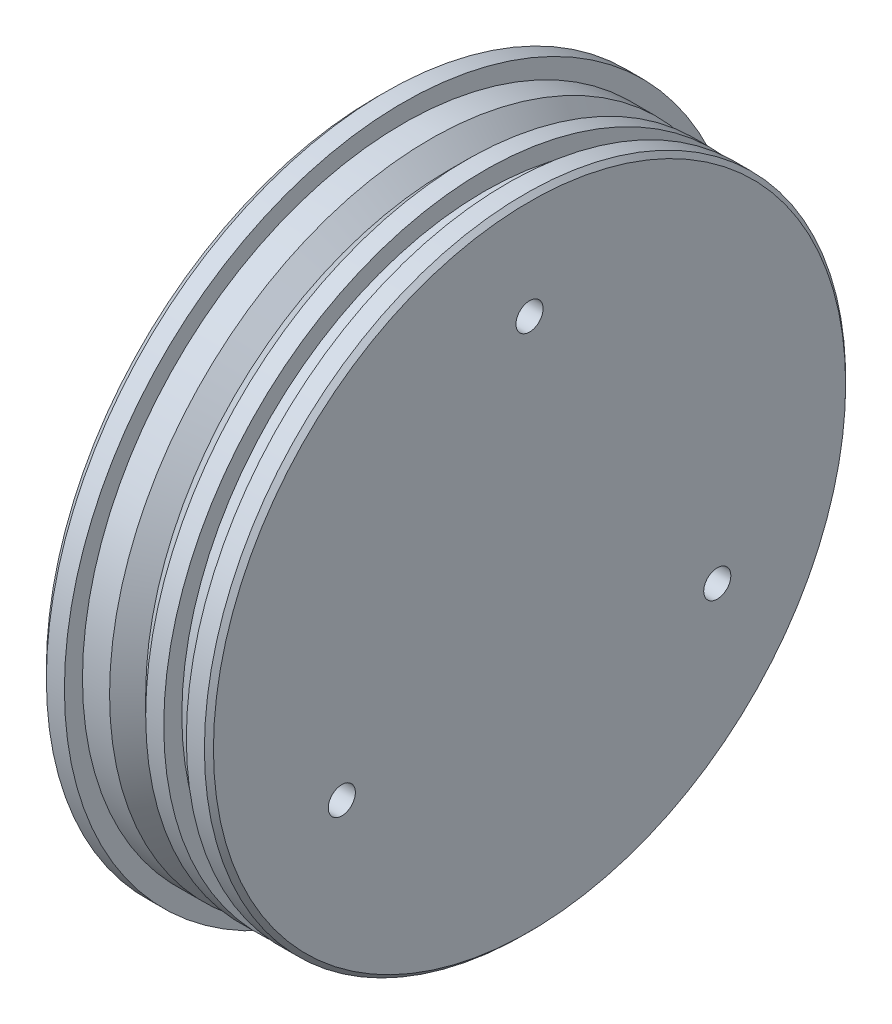
ISO-10303-21;
HEADER;
FILE_DESCRIPTION(('STEP AP214'),'2;1');
FILE_NAME('part.step','',(''),(''),'','','');
FILE_SCHEMA(('AUTOMOTIVE_DESIGN { 1 0 10303 214 1 1 1 1 }'));
ENDSEC;
DATA;
#1=APPLICATION_CONTEXT('core data for automotive mechanical design processes');
#2=APPLICATION_PROTOCOL_DEFINITION('international standard','automotive_design',2000,#1);
#3=PRODUCT_CONTEXT('',#1,'mechanical');
#4=PRODUCT('Part','Part','',(#3));
#5=PRODUCT_RELATED_PRODUCT_CATEGORY('part','',(#4));
#6=PRODUCT_DEFINITION_FORMATION('','',#4);
#7=PRODUCT_DEFINITION_CONTEXT('part definition',#1,'design');
#8=PRODUCT_DEFINITION('design','',#6,#7);
#9=PRODUCT_DEFINITION_SHAPE('','',#8);
#10=(LENGTH_UNIT() NAMED_UNIT(*) SI_UNIT(.MILLI.,.METRE.));
#11=(NAMED_UNIT(*) PLANE_ANGLE_UNIT() SI_UNIT($,.RADIAN.));
#12=(NAMED_UNIT(*) SI_UNIT($,.STERADIAN.) SOLID_ANGLE_UNIT());
#13=UNCERTAINTY_MEASURE_WITH_UNIT(LENGTH_MEASURE(1.E-05),#10,'distance_accuracy_value','');
#14=(GEOMETRIC_REPRESENTATION_CONTEXT(3) GLOBAL_UNCERTAINTY_ASSIGNED_CONTEXT((#13)) GLOBAL_UNIT_ASSIGNED_CONTEXT((#10,
#11,#12)) REPRESENTATION_CONTEXT('',''));
#15=CARTESIAN_POINT('',(0.,0.,0.));
#16=DIRECTION('',(0.,0.,1.));
#17=DIRECTION('',(1.,0.,0.));
#18=AXIS2_PLACEMENT_3D('',#15,#16,#17);
#19=CARTESIAN_POINT('',(-17.,0.,0.));
#20=DIRECTION('',(1.,0.,0.));
#21=DIRECTION('',(0.,0.,-1.));
#22=AXIS2_PLACEMENT_3D('',#19,#20,#21);
#23=PLANE('',#22);
#24=CARTESIAN_POINT('',(-17.,0.,0.));
#25=DIRECTION('',(-1.,0.,0.));
#26=DIRECTION('',(0.,0.,1.));
#27=AXIS2_PLACEMENT_3D('',#24,#25,#26);
#28=CIRCLE('',#27,36.5);
#29=CARTESIAN_POINT('',(-17.,0.,36.5));
#30=VERTEX_POINT('',#29);
#31=EDGE_CURVE('E10',#30,#30,#28,.T.);
#32=ORIENTED_EDGE('',*,*,#31,.T.);
#33=EDGE_LOOP('',(#32));
#34=FACE_BOUND('',#33,.T.);
#35=ADVANCED_FACE('F37',(#34),#23,.F.);
#36=CARTESIAN_POINT('',(-16.,0.,0.));
#37=DIRECTION('',(1.,0.,0.));
#38=DIRECTION('',(0.,0.,-1.));
#39=AXIS2_PLACEMENT_3D('',#36,#37,#38);
#40=CONICAL_SURFACE('',#39,37.5,0.78539816339745);
#41=ORIENTED_EDGE('',*,*,#31,.F.);
#42=EDGE_LOOP('',(#41));
#43=FACE_BOUND('',#42,.T.);
#44=CARTESIAN_POINT('',(-16.,0.,0.));
#45=DIRECTION('',(-1.,0.,0.));
#46=DIRECTION('',(0.,0.,1.));
#47=AXIS2_PLACEMENT_3D('',#44,#45,#46);
#48=CIRCLE('',#47,37.5);
#49=CARTESIAN_POINT('',(-16.,0.,37.5));
#50=VERTEX_POINT('',#49);
#51=EDGE_CURVE('E43',#50,#50,#48,.T.);
#52=ORIENTED_EDGE('',*,*,#51,.T.);
#53=EDGE_LOOP('',(#52));
#54=FACE_BOUND('',#53,.T.);
#55=ADVANCED_FACE('F135',(#43,#54),#40,.T.);
#56=CARTESIAN_POINT('',(0.,0.,0.));
#57=DIRECTION('',(-1.,0.,0.));
#58=DIRECTION('',(0.,0.,1.));
#59=AXIS2_PLACEMENT_3D('',#56,#57,#58);
#60=CYLINDRICAL_SURFACE('',#59,37.5);
#61=ORIENTED_EDGE('',*,*,#51,.F.);
#62=EDGE_LOOP('',(#61));
#63=FACE_BOUND('',#62,.T.);
#64=CARTESIAN_POINT('',(-14.,0.,0.));
#65=DIRECTION('',(-1.,0.,0.));
#66=DIRECTION('',(0.,0.,1.));
#67=AXIS2_PLACEMENT_3D('',#64,#65,#66);
#68=CIRCLE('',#67,37.5);
#69=CARTESIAN_POINT('',(-14.,0.,37.5));
#70=VERTEX_POINT('',#69);
#71=EDGE_CURVE('E47',#70,#70,#68,.T.);
#72=ORIENTED_EDGE('',*,*,#71,.T.);
#73=EDGE_LOOP('',(#72));
#74=FACE_BOUND('',#73,.T.);
#75=ADVANCED_FACE('F139',(#63,#74),#60,.T.);
#76=CARTESIAN_POINT('',(-14.,37.5,0.));
#77=DIRECTION('',(-1.,0.,0.));
#78=DIRECTION('',(0.,0.,1.));
#79=AXIS2_PLACEMENT_3D('',#76,#77,#78);
#80=PLANE('',#79);
#81=ORIENTED_EDGE('',*,*,#71,.F.);
#82=EDGE_LOOP('',(#81));
#83=FACE_BOUND('',#82,.T.);
#84=CARTESIAN_POINT('',(-14.,0.,0.));
#85=DIRECTION('',(-1.,0.,0.));
#86=DIRECTION('',(0.,0.,1.));
#87=AXIS2_PLACEMENT_3D('',#84,#85,#86);
#88=CIRCLE('',#87,35.5);
#89=CARTESIAN_POINT('',(-14.,0.,35.5));
#90=VERTEX_POINT('',#89);
#91=EDGE_CURVE('E51',#90,#90,#88,.T.);
#92=ORIENTED_EDGE('',*,*,#91,.T.);
#93=EDGE_LOOP('',(#92));
#94=FACE_BOUND('',#93,.T.);
#95=ADVANCED_FACE('F144',(#83,#94),#80,.F.);
#96=CARTESIAN_POINT('',(0.,0.,0.));
#97=DIRECTION('',(-1.,0.,0.));
#98=DIRECTION('',(0.,0.,1.));
#99=AXIS2_PLACEMENT_3D('',#96,#97,#98);
#100=CYLINDRICAL_SURFACE('',#99,35.5);
#101=ORIENTED_EDGE('',*,*,#91,.F.);
#102=EDGE_LOOP('',(#101));
#103=FACE_BOUND('',#102,.T.);
#104=CARTESIAN_POINT('',(-11.,0.,0.));
#105=DIRECTION('',(-1.,0.,0.));
#106=DIRECTION('',(0.,0.,1.));
#107=AXIS2_PLACEMENT_3D('',#104,#105,#106);
#108=CIRCLE('',#107,35.5);
#109=CARTESIAN_POINT('',(-11.,0.,35.5));
#110=VERTEX_POINT('',#109);
#111=EDGE_CURVE('E56',#110,#110,#108,.T.);
#112=ORIENTED_EDGE('',*,*,#111,.T.);
#113=EDGE_LOOP('',(#112));
#114=FACE_BOUND('',#113,.T.);
#115=ADVANCED_FACE('F150',(#103,#114),#100,.T.);
#116=CARTESIAN_POINT('',(-9.00000000000003,0.,0.));
#117=DIRECTION('',(-1.,0.,0.));
#118=DIRECTION('',(0.,0.,1.));
#119=AXIS2_PLACEMENT_3D('',#116,#117,#118);
#120=CONICAL_SURFACE('',#119,33.5,0.78539816339745);
#121=ORIENTED_EDGE('',*,*,#111,.F.);
#122=EDGE_LOOP('',(#121));
#123=FACE_BOUND('',#122,.T.);
#124=CARTESIAN_POINT('',(-9.00000000000003,0.,0.));
#125=DIRECTION('',(-1.,0.,0.));
#126=DIRECTION('',(0.,0.,1.));
#127=AXIS2_PLACEMENT_3D('',#124,#125,#126);
#128=CIRCLE('',#127,33.5);
#129=CARTESIAN_POINT('',(-9.00000000000003,0.,33.5));
#130=VERTEX_POINT('',#129);
#131=EDGE_CURVE('E59',#130,#130,#128,.T.);
#132=ORIENTED_EDGE('',*,*,#131,.T.);
#133=EDGE_LOOP('',(#132));
#134=FACE_BOUND('',#133,.T.);
#135=ADVANCED_FACE('F154',(#123,#134),#120,.T.);
#136=CARTESIAN_POINT('',(-7.00000000000002,0.,0.));
#137=DIRECTION('',(1.,0.,0.));
#138=DIRECTION('',(0.,0.,-1.));
#139=AXIS2_PLACEMENT_3D('',#136,#137,#138);
#140=CONICAL_SURFACE('',#139,35.5,0.785398163397443);
#141=ORIENTED_EDGE('',*,*,#131,.F.);
#142=EDGE_LOOP('',(#141));
#143=FACE_BOUND('',#142,.T.);
#144=CARTESIAN_POINT('',(-7.00000000000002,0.,0.));
#145=DIRECTION('',(-1.,0.,0.));
#146=DIRECTION('',(0.,0.,1.));
#147=AXIS2_PLACEMENT_3D('',#144,#145,#146);
#148=CIRCLE('',#147,35.5);
#149=CARTESIAN_POINT('',(-7.00000000000002,0.,35.5));
#150=VERTEX_POINT('',#149);
#151=EDGE_CURVE('E62',#150,#150,#148,.T.);
#152=ORIENTED_EDGE('',*,*,#151,.T.);
#153=EDGE_LOOP('',(#152));
#154=FACE_BOUND('',#153,.T.);
#155=ADVANCED_FACE('F158',(#143,#154),#140,.T.);
#156=CARTESIAN_POINT('',(0.,0.,0.));
#157=DIRECTION('',(-1.,0.,0.));
#158=DIRECTION('',(0.,0.,1.));
#159=AXIS2_PLACEMENT_3D('',#156,#157,#158);
#160=CYLINDRICAL_SURFACE('',#159,35.5);
#161=ORIENTED_EDGE('',*,*,#151,.F.);
#162=EDGE_LOOP('',(#161));
#163=FACE_BOUND('',#162,.T.);
#164=CARTESIAN_POINT('',(-5.00000000000002,0.,0.));
#165=DIRECTION('',(-1.,0.,0.));
#166=DIRECTION('',(0.,0.,1.));
#167=AXIS2_PLACEMENT_3D('',#164,#165,#166);
#168=CIRCLE('',#167,35.5);
#169=CARTESIAN_POINT('',(-5.00000000000002,0.,35.5));
#170=VERTEX_POINT('',#169);
#171=EDGE_CURVE('E65',#170,#170,#168,.T.);
#172=ORIENTED_EDGE('',*,*,#171,.T.);
#173=EDGE_LOOP('',(#172));
#174=FACE_BOUND('',#173,.T.);
#175=ADVANCED_FACE('F162',(#163,#174),#160,.T.);
#176=CARTESIAN_POINT('',(-5.00000000000002,35.5,0.));
#177=DIRECTION('',(-1.,0.,0.));
#178=DIRECTION('',(0.,0.,1.));
#179=AXIS2_PLACEMENT_3D('',#176,#177,#178);
#180=PLANE('',#179);
#181=ORIENTED_EDGE('',*,*,#171,.F.);
#182=EDGE_LOOP('',(#181));
#183=FACE_BOUND('',#182,.T.);
#184=CARTESIAN_POINT('',(-5.00000000000002,0.,0.));
#185=DIRECTION('',(-1.,0.,0.));
#186=DIRECTION('',(0.,0.,1.));
#187=AXIS2_PLACEMENT_3D('',#184,#185,#186);
#188=CIRCLE('',#187,33.5);
#189=CARTESIAN_POINT('',(-5.00000000000002,0.,33.5));
#190=VERTEX_POINT('',#189);
#191=EDGE_CURVE('E68',#190,#190,#188,.T.);
#192=ORIENTED_EDGE('',*,*,#191,.T.);
#193=EDGE_LOOP('',(#192));
#194=FACE_BOUND('',#193,.T.);
#195=ADVANCED_FACE('F166',(#183,#194),#180,.F.);
#196=CARTESIAN_POINT('',(0.,0.,0.));
#197=DIRECTION('',(-1.,0.,0.));
#198=DIRECTION('',(0.,0.,1.));
#199=AXIS2_PLACEMENT_3D('',#196,#197,#198);
#200=CYLINDRICAL_SURFACE('',#199,33.5);
#201=ORIENTED_EDGE('',*,*,#191,.F.);
#202=EDGE_LOOP('',(#201));
#203=FACE_BOUND('',#202,.T.);
#204=CARTESIAN_POINT('',(-2.50000000000002,0.,0.));
#205=DIRECTION('',(-1.,0.,0.));
#206=DIRECTION('',(0.,0.,1.));
#207=AXIS2_PLACEMENT_3D('',#204,#205,#206);
#208=CIRCLE('',#207,33.5);
#209=CARTESIAN_POINT('',(-2.50000000000002,0.,33.5));
#210=VERTEX_POINT('',#209);
#211=EDGE_CURVE('E71',#210,#210,#208,.T.);
#212=ORIENTED_EDGE('',*,*,#211,.T.);
#213=EDGE_LOOP('',(#212));
#214=FACE_BOUND('',#213,.T.);
#215=ADVANCED_FACE('F170',(#203,#214),#200,.T.);
#216=CARTESIAN_POINT('',(-2.50000000000001,33.5,0.));
#217=DIRECTION('',(1.,0.,0.));
#218=DIRECTION('',(0.,0.,-1.));
#219=AXIS2_PLACEMENT_3D('',#216,#217,#218);
#220=PLANE('',#219);
#221=ORIENTED_EDGE('',*,*,#211,.F.);
#222=EDGE_LOOP('',(#221));
#223=FACE_BOUND('',#222,.T.);
#224=CARTESIAN_POINT('',(-2.50000000000001,0.,0.));
#225=DIRECTION('',(-1.,0.,0.));
#226=DIRECTION('',(0.,0.,1.));
#227=AXIS2_PLACEMENT_3D('',#224,#225,#226);
#228=CIRCLE('',#227,35.5);
#229=CARTESIAN_POINT('',(-2.50000000000001,0.,35.5));
#230=VERTEX_POINT('',#229);
#231=EDGE_CURVE('E74',#230,#230,#228,.T.);
#232=ORIENTED_EDGE('',*,*,#231,.T.);
#233=EDGE_LOOP('',(#232));
#234=FACE_BOUND('',#233,.T.);
#235=ADVANCED_FACE('F130',(#223,#234),#220,.F.);
#236=CARTESIAN_POINT('',(0.,0.,0.));
#237=DIRECTION('',(-1.,0.,0.));
#238=DIRECTION('',(0.,0.,1.));
#239=AXIS2_PLACEMENT_3D('',#236,#237,#238);
#240=CYLINDRICAL_SURFACE('',#239,35.5);
#241=ORIENTED_EDGE('',*,*,#231,.F.);
#242=EDGE_LOOP('',(#241));
#243=FACE_BOUND('',#242,.T.);
#244=CARTESIAN_POINT('',(-0.500000000000004,0.,0.));
#245=DIRECTION('',(-1.,0.,0.));
#246=DIRECTION('',(0.,0.,1.));
#247=AXIS2_PLACEMENT_3D('',#244,#245,#246);
#248=CIRCLE('',#247,35.5);
#249=CARTESIAN_POINT('',(-0.500000000000004,0.,35.5));
#250=VERTEX_POINT('',#249);
#251=EDGE_CURVE('E77',#250,#250,#248,.T.);
#252=ORIENTED_EDGE('',*,*,#251,.T.);
#253=EDGE_LOOP('',(#252));
#254=FACE_BOUND('',#253,.T.);
#255=ADVANCED_FACE('F124',(#243,#254),#240,.T.);
#256=CARTESIAN_POINT('',(0.,0.,0.));
#257=DIRECTION('',(-1.,0.,0.));
#258=DIRECTION('',(0.,0.,1.));
#259=AXIS2_PLACEMENT_3D('',#256,#257,#258);
#260=CONICAL_SURFACE('',#259,35.,0.785398163397446);
#261=ORIENTED_EDGE('',*,*,#251,.F.);
#262=EDGE_LOOP('',(#261));
#263=FACE_BOUND('',#262,.T.);
#264=CARTESIAN_POINT('',(0.,0.,0.));
#265=DIRECTION('',(-1.,0.,0.));
#266=DIRECTION('',(0.,0.,1.));
#267=AXIS2_PLACEMENT_3D('',#264,#265,#266);
#268=CIRCLE('',#267,35.);
#269=CARTESIAN_POINT('',(0.,0.,35.));
#270=VERTEX_POINT('',#269);
#271=EDGE_CURVE('E80',#270,#270,#268,.T.);
#272=ORIENTED_EDGE('',*,*,#271,.T.);
#273=EDGE_LOOP('',(#272));
#274=FACE_BOUND('',#273,.T.);
#275=ADVANCED_FACE('F115',(#263,#274),#260,.T.);
#276=CARTESIAN_POINT('',(0.,35.,0.));
#277=DIRECTION('',(-1.,0.,0.));
#278=DIRECTION('',(0.,0.,1.));
#279=AXIS2_PLACEMENT_3D('',#276,#277,#278);
#280=PLANE('',#279);
#281=CARTESIAN_POINT('',(0.,24.,0.));
#282=DIRECTION('',(1.,0.,0.));
#283=DIRECTION('',(0.,0.,-1.));
#284=AXIS2_PLACEMENT_3D('',#281,#282,#283);
#285=CIRCLE('',#284,1.5);
#286=CARTESIAN_POINT('',(0.,24.,-1.5));
#287=VERTEX_POINT('',#286);
#288=EDGE_CURVE('E96',#287,#287,#285,.T.);
#289=ORIENTED_EDGE('',*,*,#288,.F.);
#290=EDGE_LOOP('',(#289));
#291=FACE_BOUND('',#290,.T.);
#292=CARTESIAN_POINT('',(0.,-12.,-20.7846096908265));
#293=DIRECTION('',(1.,0.,0.));
#294=DIRECTION('',(0.,0.,-1.));
#295=AXIS2_PLACEMENT_3D('',#292,#293,#294);
#296=CIRCLE('',#295,1.5);
#297=CARTESIAN_POINT('',(0.,-12.,-22.2846096908265));
#298=VERTEX_POINT('',#297);
#299=EDGE_CURVE('E90',#298,#298,#296,.T.);
#300=ORIENTED_EDGE('',*,*,#299,.F.);
#301=EDGE_LOOP('',(#300));
#302=FACE_BOUND('',#301,.T.);
#303=CARTESIAN_POINT('',(0.,-12.,20.7846096908265));
#304=DIRECTION('',(1.,0.,0.));
#305=DIRECTION('',(0.,0.,-1.));
#306=AXIS2_PLACEMENT_3D('',#303,#304,#305);
#307=CIRCLE('',#306,1.5);
#308=CARTESIAN_POINT('',(0.,-12.,19.2846096908265));
#309=VERTEX_POINT('',#308);
#310=EDGE_CURVE('E84',#309,#309,#307,.T.);
#311=ORIENTED_EDGE('',*,*,#310,.F.);
#312=EDGE_LOOP('',(#311));
#313=FACE_BOUND('',#312,.T.);
#314=ORIENTED_EDGE('',*,*,#271,.F.);
#315=EDGE_LOOP('',(#314));
#316=FACE_BOUND('',#315,.T.);
#317=ADVANCED_FACE('F111',(#291,#302,#313,#316),#280,.F.);
#318=CARTESIAN_POINT('',(-10.,-12.,20.7846096908265));
#319=DIRECTION('',(1.,0.,0.));
#320=DIRECTION('',(0.,0.,-1.));
#321=AXIS2_PLACEMENT_3D('',#318,#319,#320);
#322=CYLINDRICAL_SURFACE('',#321,1.5);
#323=CARTESIAN_POINT('',(-10.,-12.,20.7846096908265));
#324=DIRECTION('',(1.,0.,0.));
#325=DIRECTION('',(0.,0.,-1.));
#326=AXIS2_PLACEMENT_3D('',#323,#324,#325);
#327=CIRCLE('',#326,1.5);
#328=CARTESIAN_POINT('',(-10.,-12.,19.2846096908265));
#329=VERTEX_POINT('',#328);
#330=EDGE_CURVE('E87',#329,#329,#327,.T.);
#331=ORIENTED_EDGE('',*,*,#330,.F.);
#332=EDGE_LOOP('',(#331));
#333=FACE_BOUND('',#332,.T.);
#334=ORIENTED_EDGE('',*,*,#310,.T.);
#335=EDGE_LOOP('',(#334));
#336=FACE_BOUND('',#335,.T.);
#337=ADVANCED_FACE('F114',(#333,#336),#322,.F.);
#338=CARTESIAN_POINT('',(-10.,-12.,20.7846096908265));
#339=DIRECTION('',(1.,0.,0.));
#340=DIRECTION('',(0.,0.,-1.));
#341=AXIS2_PLACEMENT_3D('',#338,#339,#340);
#342=PLANE('',#341);
#343=ORIENTED_EDGE('',*,*,#330,.T.);
#344=EDGE_LOOP('',(#343));
#345=FACE_BOUND('',#344,.T.);
#346=ADVANCED_FACE('F209',(#345),#342,.T.);
#347=CARTESIAN_POINT('',(-10.,-12.,-20.7846096908265));
#348=DIRECTION('',(1.,0.,0.));
#349=DIRECTION('',(0.,0.,-1.));
#350=AXIS2_PLACEMENT_3D('',#347,#348,#349);
#351=CYLINDRICAL_SURFACE('',#350,1.5);
#352=CARTESIAN_POINT('',(-10.,-12.,-20.7846096908265));
#353=DIRECTION('',(1.,0.,0.));
#354=DIRECTION('',(0.,0.,-1.));
#355=AXIS2_PLACEMENT_3D('',#352,#353,#354);
#356=CIRCLE('',#355,1.5);
#357=CARTESIAN_POINT('',(-10.,-12.,-22.2846096908265));
#358=VERTEX_POINT('',#357);
#359=EDGE_CURVE('E93',#358,#358,#356,.T.);
#360=ORIENTED_EDGE('',*,*,#359,.F.);
#361=EDGE_LOOP('',(#360));
#362=FACE_BOUND('',#361,.T.);
#363=ORIENTED_EDGE('',*,*,#299,.T.);
#364=EDGE_LOOP('',(#363));
#365=FACE_BOUND('',#364,.T.);
#366=ADVANCED_FACE('F219',(#362,#365),#351,.F.);
#367=CARTESIAN_POINT('',(-10.,-12.,-20.7846096908265));
#368=DIRECTION('',(1.,0.,0.));
#369=DIRECTION('',(0.,0.,-1.));
#370=AXIS2_PLACEMENT_3D('',#367,#368,#369);
#371=PLANE('',#370);
#372=ORIENTED_EDGE('',*,*,#359,.T.);
#373=EDGE_LOOP('',(#372));
#374=FACE_BOUND('',#373,.T.);
#375=ADVANCED_FACE('F107',(#374),#371,.T.);
#376=CARTESIAN_POINT('',(-10.,24.,0.));
#377=DIRECTION('',(1.,0.,0.));
#378=DIRECTION('',(0.,0.,-1.));
#379=AXIS2_PLACEMENT_3D('',#376,#377,#378);
#380=CYLINDRICAL_SURFACE('',#379,1.5);
#381=CARTESIAN_POINT('',(-10.,24.,0.));
#382=DIRECTION('',(1.,0.,0.));
#383=DIRECTION('',(0.,0.,-1.));
#384=AXIS2_PLACEMENT_3D('',#381,#382,#383);
#385=CIRCLE('',#384,1.5);
#386=CARTESIAN_POINT('',(-10.,24.,-1.5));
#387=VERTEX_POINT('',#386);
#388=EDGE_CURVE('E83',#387,#387,#385,.T.);
#389=ORIENTED_EDGE('',*,*,#388,.F.);
#390=EDGE_LOOP('',(#389));
#391=FACE_BOUND('',#390,.T.);
#392=ORIENTED_EDGE('',*,*,#288,.T.);
#393=EDGE_LOOP('',(#392));
#394=FACE_BOUND('',#393,.T.);
#395=ADVANCED_FACE('F104',(#391,#394),#380,.F.);
#396=CARTESIAN_POINT('',(-10.,24.,0.));
#397=DIRECTION('',(1.,0.,0.));
#398=DIRECTION('',(0.,0.,-1.));
#399=AXIS2_PLACEMENT_3D('',#396,#397,#398);
#400=PLANE('',#399);
#401=ORIENTED_EDGE('',*,*,#388,.T.);
#402=EDGE_LOOP('',(#401));
#403=FACE_BOUND('',#402,.T.);
#404=ADVANCED_FACE('F102',(#403),#400,.T.);
#405=CLOSED_SHELL('',(#35,#55,#75,#95,#115,#135,#155,#175,#195,#215,#235,#255,#275,#317,#337,
#346,#366,#375,#395,#404));
#406=MANIFOLD_SOLID_BREP('B2',#405);
#407=ADVANCED_BREP_SHAPE_REPRESENTATION('',(#18,#406),#14);
#408=SHAPE_DEFINITION_REPRESENTATION(#9,#407);
ENDSEC;
END-ISO-10303-21;
